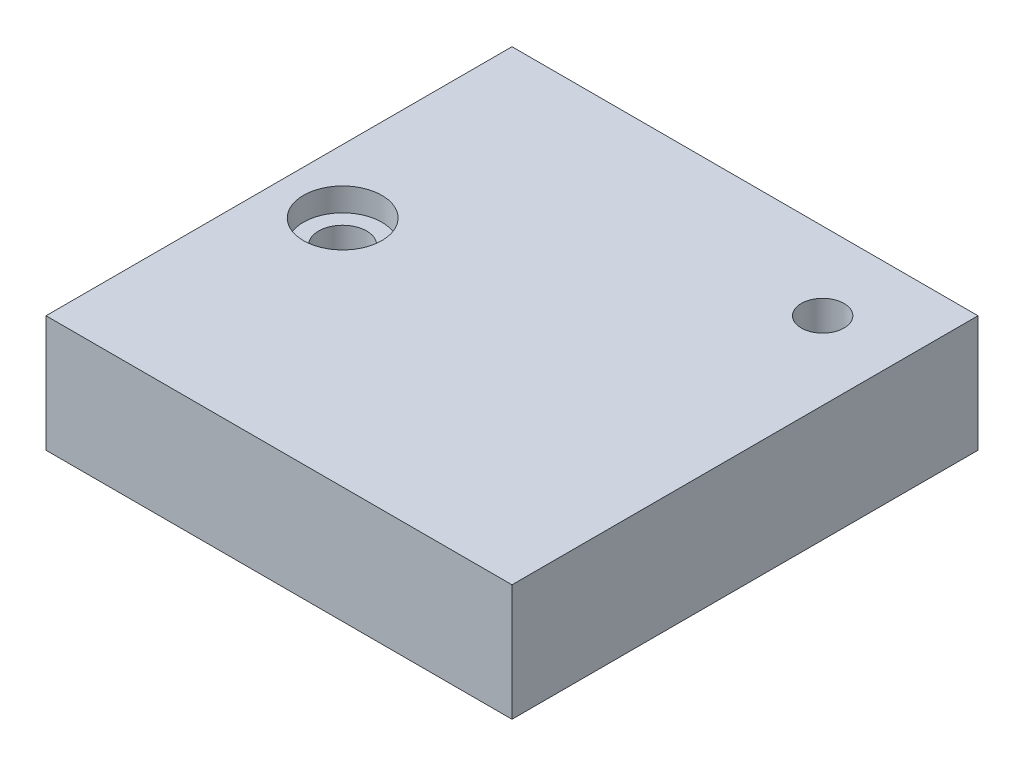
ISO-10303-21;
HEADER;
FILE_DESCRIPTION(('STEP AP214'),'2;1');
FILE_NAME('part.step','',(''),(''),'','','');
FILE_SCHEMA(('AUTOMOTIVE_DESIGN { 1 0 10303 214 1 1 1 1 }'));
ENDSEC;
DATA;
#1=APPLICATION_CONTEXT('core data for automotive mechanical design processes');
#2=APPLICATION_PROTOCOL_DEFINITION('international standard','automotive_design',2000,#1);
#3=PRODUCT_CONTEXT('',#1,'mechanical');
#4=PRODUCT('Part','Part','',(#3));
#5=PRODUCT_RELATED_PRODUCT_CATEGORY('part','',(#4));
#6=PRODUCT_DEFINITION_FORMATION('','',#4);
#7=PRODUCT_DEFINITION_CONTEXT('part definition',#1,'design');
#8=PRODUCT_DEFINITION('design','',#6,#7);
#9=PRODUCT_DEFINITION_SHAPE('','',#8);
#10=(LENGTH_UNIT() NAMED_UNIT(*) SI_UNIT(.MILLI.,.METRE.));
#11=(NAMED_UNIT(*) PLANE_ANGLE_UNIT() SI_UNIT($,.RADIAN.));
#12=(NAMED_UNIT(*) SI_UNIT($,.STERADIAN.) SOLID_ANGLE_UNIT());
#13=UNCERTAINTY_MEASURE_WITH_UNIT(LENGTH_MEASURE(1.E-05),#10,'distance_accuracy_value','');
#14=(GEOMETRIC_REPRESENTATION_CONTEXT(3) GLOBAL_UNCERTAINTY_ASSIGNED_CONTEXT((#13)) GLOBAL_UNIT_ASSIGNED_CONTEXT((#10,
#11,#12)) REPRESENTATION_CONTEXT('',''));
#15=CARTESIAN_POINT('',(0.,0.,0.));
#16=DIRECTION('',(0.,0.,1.));
#17=DIRECTION('',(1.,0.,0.));
#18=AXIS2_PLACEMENT_3D('',#15,#16,#17);
#19=CARTESIAN_POINT('',(-30.,15.,30.));
#20=DIRECTION('',(0.,0.,-1.));
#21=DIRECTION('',(-1.,0.,0.));
#22=AXIS2_PLACEMENT_3D('',#19,#20,#21);
#23=PLANE('',#22);
#24=DIRECTION('',(1.,0.,0.));
#25=VECTOR('',#24,1.);
#26=CARTESIAN_POINT('',(-30.,0.,30.));
#27=LINE('',#26,#25);
#28=CARTESIAN_POINT('',(-30.,0.,30.));
#29=VERTEX_POINT('',#28);
#30=CARTESIAN_POINT('',(30.,0.,30.));
#31=VERTEX_POINT('',#30);
#32=EDGE_CURVE('E101',#29,#31,#27,.T.);
#33=ORIENTED_EDGE('',*,*,#32,.T.);
#34=DIRECTION('',(0.,-1.,0.));
#35=VECTOR('',#34,1.);
#36=CARTESIAN_POINT('',(30.,15.,30.));
#37=LINE('',#36,#35);
#38=CARTESIAN_POINT('',(30.,15.,30.));
#39=VERTEX_POINT('',#38);
#40=EDGE_CURVE('E11',#39,#31,#37,.T.);
#41=ORIENTED_EDGE('',*,*,#40,.F.);
#42=DIRECTION('',(1.,0.,0.));
#43=VECTOR('',#42,1.);
#44=CARTESIAN_POINT('',(-30.,15.,30.));
#45=LINE('',#44,#43);
#46=CARTESIAN_POINT('',(-30.,15.,30.));
#47=VERTEX_POINT('',#46);
#48=EDGE_CURVE('E80',#47,#39,#45,.T.);
#49=ORIENTED_EDGE('',*,*,#48,.F.);
#50=DIRECTION('',(0.,-1.,0.));
#51=VECTOR('',#50,1.);
#52=CARTESIAN_POINT('',(-30.,15.,30.));
#53=LINE('',#52,#51);
#54=EDGE_CURVE('E100',#47,#29,#53,.T.);
#55=ORIENTED_EDGE('',*,*,#54,.T.);
#56=EDGE_LOOP('',(#33,#41,#49,#55));
#57=FACE_BOUND('',#56,.T.);
#58=ADVANCED_FACE('F39',(#57),#23,.F.);
#59=CARTESIAN_POINT('',(30.,15.,-30.));
#60=DIRECTION('',(1.,0.,0.));
#61=DIRECTION('',(0.,0.,-1.));
#62=AXIS2_PLACEMENT_3D('',#59,#60,#61);
#63=PLANE('',#62);
#64=DIRECTION('',(0.,0.,1.));
#65=VECTOR('',#64,1.);
#66=CARTESIAN_POINT('',(30.,0.,-30.));
#67=LINE('',#66,#65);
#68=CARTESIAN_POINT('',(30.,0.,-30.));
#69=VERTEX_POINT('',#68);
#70=EDGE_CURVE('E87',#69,#31,#67,.T.);
#71=ORIENTED_EDGE('',*,*,#70,.F.);
#72=DIRECTION('',(0.,-1.,0.));
#73=VECTOR('',#72,1.);
#74=CARTESIAN_POINT('',(30.,15.,-30.));
#75=LINE('',#74,#73);
#76=CARTESIAN_POINT('',(30.,15.,-30.));
#77=VERTEX_POINT('',#76);
#78=EDGE_CURVE('E50',#77,#69,#75,.T.);
#79=ORIENTED_EDGE('',*,*,#78,.F.);
#80=DIRECTION('',(0.,0.,1.));
#81=VECTOR('',#80,1.);
#82=CARTESIAN_POINT('',(30.,15.,-30.));
#83=LINE('',#82,#81);
#84=EDGE_CURVE('E82',#77,#39,#83,.T.);
#85=ORIENTED_EDGE('',*,*,#84,.T.);
#86=ORIENTED_EDGE('',*,*,#40,.T.);
#87=EDGE_LOOP('',(#71,#79,#85,#86));
#88=FACE_BOUND('',#87,.T.);
#89=ADVANCED_FACE('F84',(#88),#63,.T.);
#90=CARTESIAN_POINT('',(-30.,15.,-30.));
#91=DIRECTION('',(0.,0.,-1.));
#92=DIRECTION('',(-1.,0.,0.));
#93=AXIS2_PLACEMENT_3D('',#90,#91,#92);
#94=PLANE('',#93);
#95=DIRECTION('',(1.,0.,0.));
#96=VECTOR('',#95,1.);
#97=CARTESIAN_POINT('',(-30.,0.,-30.));
#98=LINE('',#97,#96);
#99=CARTESIAN_POINT('',(-30.,0.,-30.));
#100=VERTEX_POINT('',#99);
#101=EDGE_CURVE('E106',#100,#69,#98,.T.);
#102=ORIENTED_EDGE('',*,*,#101,.F.);
#103=DIRECTION('',(0.,-1.,0.));
#104=VECTOR('',#103,1.);
#105=CARTESIAN_POINT('',(-30.,15.,-30.));
#106=LINE('',#105,#104);
#107=CARTESIAN_POINT('',(-30.,15.,-30.));
#108=VERTEX_POINT('',#107);
#109=EDGE_CURVE('E67',#108,#100,#106,.T.);
#110=ORIENTED_EDGE('',*,*,#109,.F.);
#111=DIRECTION('',(1.,0.,0.));
#112=VECTOR('',#111,1.);
#113=CARTESIAN_POINT('',(-30.,15.,-30.));
#114=LINE('',#113,#112);
#115=EDGE_CURVE('E91',#108,#77,#114,.T.);
#116=ORIENTED_EDGE('',*,*,#115,.T.);
#117=ORIENTED_EDGE('',*,*,#78,.T.);
#118=EDGE_LOOP('',(#102,#110,#116,#117));
#119=FACE_BOUND('',#118,.T.);
#120=ADVANCED_FACE('F92',(#119),#94,.T.);
#121=CARTESIAN_POINT('',(-30.,15.,-30.));
#122=DIRECTION('',(1.,0.,0.));
#123=DIRECTION('',(0.,0.,-1.));
#124=AXIS2_PLACEMENT_3D('',#121,#122,#123);
#125=PLANE('',#124);
#126=DIRECTION('',(0.,0.,1.));
#127=VECTOR('',#126,1.);
#128=CARTESIAN_POINT('',(-30.,0.,-30.));
#129=LINE('',#128,#127);
#130=EDGE_CURVE('E71',#100,#29,#129,.T.);
#131=ORIENTED_EDGE('',*,*,#130,.T.);
#132=ORIENTED_EDGE('',*,*,#54,.F.);
#133=DIRECTION('',(0.,0.,1.));
#134=VECTOR('',#133,1.);
#135=CARTESIAN_POINT('',(-30.,15.,-30.));
#136=LINE('',#135,#134);
#137=EDGE_CURVE('E54',#108,#47,#136,.T.);
#138=ORIENTED_EDGE('',*,*,#137,.F.);
#139=ORIENTED_EDGE('',*,*,#109,.T.);
#140=EDGE_LOOP('',(#131,#132,#138,#139));
#141=FACE_BOUND('',#140,.T.);
#142=ADVANCED_FACE('F127',(#141),#125,.F.);
#143=CARTESIAN_POINT('',(0.,15.,0.));
#144=DIRECTION('',(0.,-1.,0.));
#145=DIRECTION('',(0.,0.,-1.));
#146=AXIS2_PLACEMENT_3D('',#143,#144,#145);
#147=PLANE('',#146);
#148=CARTESIAN_POINT('',(20.,15.,-20.));
#149=DIRECTION('',(0.,1.,0.));
#150=DIRECTION('',(0.,0.,1.));
#151=AXIS2_PLACEMENT_3D('',#148,#149,#150);
#152=CIRCLE('',#151,2.75);
#153=CARTESIAN_POINT('',(20.,15.,-17.25));
#154=VERTEX_POINT('',#153);
#155=EDGE_CURVE('E200',#154,#154,#152,.T.);
#156=ORIENTED_EDGE('',*,*,#155,.F.);
#157=EDGE_LOOP('',(#156));
#158=FACE_BOUND('',#157,.T.);
#159=CARTESIAN_POINT('',(-21.8044933647821,15.,0.));
#160=DIRECTION('',(0.,1.,0.));
#161=DIRECTION('',(0.,0.,1.));
#162=AXIS2_PLACEMENT_3D('',#159,#160,#161);
#163=CIRCLE('',#162,5.05);
#164=CARTESIAN_POINT('',(-21.8044933647821,15.,5.05));
#165=VERTEX_POINT('',#164);
#166=EDGE_CURVE('E210',#165,#165,#163,.T.);
#167=ORIENTED_EDGE('',*,*,#166,.F.);
#168=EDGE_LOOP('',(#167));
#169=FACE_BOUND('',#168,.T.);
#170=ORIENTED_EDGE('',*,*,#48,.T.);
#171=ORIENTED_EDGE('',*,*,#84,.F.);
#172=ORIENTED_EDGE('',*,*,#115,.F.);
#173=ORIENTED_EDGE('',*,*,#137,.T.);
#174=EDGE_LOOP('',(#170,#171,#172,#173));
#175=FACE_BOUND('',#174,.T.);
#176=ADVANCED_FACE('F95',(#158,#169,#175),#147,.F.);
#177=CARTESIAN_POINT('',(0.,0.,0.));
#178=DIRECTION('',(0.,-1.,0.));
#179=DIRECTION('',(0.,0.,-1.));
#180=AXIS2_PLACEMENT_3D('',#177,#178,#179);
#181=PLANE('',#180);
#182=CARTESIAN_POINT('',(-21.8044933647821,0.,0.));
#183=DIRECTION('',(0.,1.,0.));
#184=DIRECTION('',(0.,0.,1.));
#185=AXIS2_PLACEMENT_3D('',#182,#183,#184);
#186=CIRCLE('',#185,3.1);
#187=CARTESIAN_POINT('',(-21.8044933647821,0.,3.1));
#188=VERTEX_POINT('',#187);
#189=EDGE_CURVE('E196',#188,#188,#186,.T.);
#190=ORIENTED_EDGE('',*,*,#189,.T.);
#191=EDGE_LOOP('',(#190));
#192=FACE_BOUND('',#191,.T.);
#193=ORIENTED_EDGE('',*,*,#32,.F.);
#194=ORIENTED_EDGE('',*,*,#130,.F.);
#195=ORIENTED_EDGE('',*,*,#101,.T.);
#196=ORIENTED_EDGE('',*,*,#70,.T.);
#197=EDGE_LOOP('',(#193,#194,#195,#196));
#198=FACE_BOUND('',#197,.T.);
#199=ADVANCED_FACE('F114',(#192,#198),#181,.T.);
#200=CARTESIAN_POINT('',(-21.8044933647821,12.,0.));
#201=DIRECTION('',(0.,1.,0.));
#202=DIRECTION('',(0.,0.,1.));
#203=AXIS2_PLACEMENT_3D('',#200,#201,#202);
#204=CYLINDRICAL_SURFACE('',#203,5.05);
#205=CARTESIAN_POINT('',(-21.8044933647821,12.,0.));
#206=DIRECTION('',(0.,1.,0.));
#207=DIRECTION('',(0.,0.,1.));
#208=AXIS2_PLACEMENT_3D('',#205,#206,#207);
#209=CIRCLE('',#208,5.05);
#210=CARTESIAN_POINT('',(-21.8044933647821,12.,5.05));
#211=VERTEX_POINT('',#210);
#212=EDGE_CURVE('E102',#211,#211,#209,.T.);
#213=ORIENTED_EDGE('',*,*,#212,.F.);
#214=EDGE_LOOP('',(#213));
#215=FACE_BOUND('',#214,.T.);
#216=ORIENTED_EDGE('',*,*,#166,.T.);
#217=EDGE_LOOP('',(#216));
#218=FACE_BOUND('',#217,.T.);
#219=ADVANCED_FACE('F113',(#215,#218),#204,.F.);
#220=CARTESIAN_POINT('',(-21.8044933647821,12.,0.));
#221=DIRECTION('',(0.,1.,0.));
#222=DIRECTION('',(0.,0.,1.));
#223=AXIS2_PLACEMENT_3D('',#220,#221,#222);
#224=PLANE('',#223);
#225=CARTESIAN_POINT('',(-21.8044933647821,12.,0.));
#226=DIRECTION('',(0.,1.,0.));
#227=DIRECTION('',(0.,0.,1.));
#228=AXIS2_PLACEMENT_3D('',#225,#226,#227);
#229=CIRCLE('',#228,3.1);
#230=CARTESIAN_POINT('',(-21.8044933647821,12.,3.1));
#231=VERTEX_POINT('',#230);
#232=EDGE_CURVE('E203',#231,#231,#229,.T.);
#233=ORIENTED_EDGE('',*,*,#232,.F.);
#234=EDGE_LOOP('',(#233));
#235=FACE_BOUND('',#234,.T.);
#236=ORIENTED_EDGE('',*,*,#212,.T.);
#237=EDGE_LOOP('',(#236));
#238=FACE_BOUND('',#237,.T.);
#239=ADVANCED_FACE('F125',(#235,#238),#224,.T.);
#240=CARTESIAN_POINT('',(-21.8044933647821,12.,0.));
#241=DIRECTION('',(0.,-1.,0.));
#242=DIRECTION('',(0.,0.,-1.));
#243=AXIS2_PLACEMENT_3D('',#240,#241,#242);
#244=CYLINDRICAL_SURFACE('',#243,3.1);
#245=ORIENTED_EDGE('',*,*,#232,.T.);
#246=EDGE_LOOP('',(#245));
#247=FACE_BOUND('',#246,.T.);
#248=ORIENTED_EDGE('',*,*,#189,.F.);
#249=EDGE_LOOP('',(#248));
#250=FACE_BOUND('',#249,.T.);
#251=ADVANCED_FACE('F165',(#247,#250),#244,.F.);
#252=CARTESIAN_POINT('',(20.,9.5,-20.));
#253=DIRECTION('',(0.,1.,0.));
#254=DIRECTION('',(0.,0.,1.));
#255=AXIS2_PLACEMENT_3D('',#252,#253,#254);
#256=CYLINDRICAL_SURFACE('',#255,2.75);
#257=CARTESIAN_POINT('',(20.,9.5,-20.));
#258=DIRECTION('',(0.,1.,0.));
#259=DIRECTION('',(0.,0.,1.));
#260=AXIS2_PLACEMENT_3D('',#257,#258,#259);
#261=CIRCLE('',#260,2.75);
#262=CARTESIAN_POINT('',(20.,9.5,-17.25));
#263=VERTEX_POINT('',#262);
#264=EDGE_CURVE('E197',#263,#263,#261,.T.);
#265=ORIENTED_EDGE('',*,*,#264,.F.);
#266=EDGE_LOOP('',(#265));
#267=FACE_BOUND('',#266,.T.);
#268=ORIENTED_EDGE('',*,*,#155,.T.);
#269=EDGE_LOOP('',(#268));
#270=FACE_BOUND('',#269,.T.);
#271=ADVANCED_FACE('F171',(#267,#270),#256,.F.);
#272=CARTESIAN_POINT('',(20.,9.5,-20.));
#273=DIRECTION('',(0.,1.,0.));
#274=DIRECTION('',(0.,0.,1.));
#275=AXIS2_PLACEMENT_3D('',#272,#273,#274);
#276=PLANE('',#275);
#277=ORIENTED_EDGE('',*,*,#264,.T.);
#278=EDGE_LOOP('',(#277));
#279=FACE_BOUND('',#278,.T.);
#280=ADVANCED_FACE('F185',(#279),#276,.T.);
#281=CLOSED_SHELL('',(#58,#89,#120,#142,#176,#199,#219,#239,#251,#271,#280));
#282=MANIFOLD_SOLID_BREP('B2',#281);
#283=ADVANCED_BREP_SHAPE_REPRESENTATION('',(#18,#282),#14);
#284=SHAPE_DEFINITION_REPRESENTATION(#9,#283);
ENDSEC;
END-ISO-10303-21;
